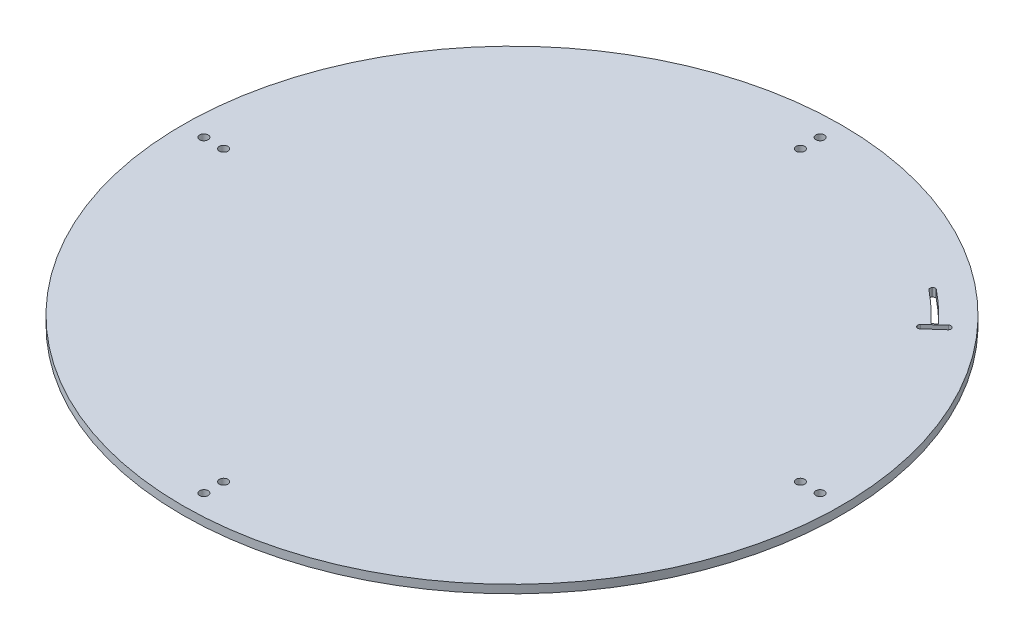
ISO-10303-21;
HEADER;
FILE_DESCRIPTION(('STEP AP214'),'2;1');
FILE_NAME('part.step','',(''),(''),'','','');
FILE_SCHEMA(('AUTOMOTIVE_DESIGN { 1 0 10303 214 1 1 1 1 }'));
ENDSEC;
DATA;
#1=APPLICATION_CONTEXT('core data for automotive mechanical design processes');
#2=APPLICATION_PROTOCOL_DEFINITION('international standard','automotive_design',2000,#1);
#3=PRODUCT_CONTEXT('',#1,'mechanical');
#4=PRODUCT('Part','Part','',(#3));
#5=PRODUCT_RELATED_PRODUCT_CATEGORY('part','',(#4));
#6=PRODUCT_DEFINITION_FORMATION('','',#4);
#7=PRODUCT_DEFINITION_CONTEXT('part definition',#1,'design');
#8=PRODUCT_DEFINITION('design','',#6,#7);
#9=PRODUCT_DEFINITION_SHAPE('','',#8);
#10=(LENGTH_UNIT() NAMED_UNIT(*) SI_UNIT(.MILLI.,.METRE.));
#11=(NAMED_UNIT(*) PLANE_ANGLE_UNIT() SI_UNIT($,.RADIAN.));
#12=(NAMED_UNIT(*) SI_UNIT($,.STERADIAN.) SOLID_ANGLE_UNIT());
#13=UNCERTAINTY_MEASURE_WITH_UNIT(LENGTH_MEASURE(1.E-05),#10,'distance_accuracy_value','');
#14=(GEOMETRIC_REPRESENTATION_CONTEXT(3) GLOBAL_UNCERTAINTY_ASSIGNED_CONTEXT((#13)) GLOBAL_UNIT_ASSIGNED_CONTEXT((#10,
#11,#12)) REPRESENTATION_CONTEXT('',''));
#15=CARTESIAN_POINT('',(0.,0.,0.));
#16=DIRECTION('',(0.,0.,1.));
#17=DIRECTION('',(1.,0.,0.));
#18=AXIS2_PLACEMENT_3D('',#15,#16,#17);
#19=CARTESIAN_POINT('',(0.,5.,0.));
#20=DIRECTION('',(0.,-1.,0.));
#21=DIRECTION('',(0.,0.,-1.));
#22=AXIS2_PLACEMENT_3D('',#19,#20,#21);
#23=CYLINDRICAL_SURFACE('',#22,200.);
#24=CARTESIAN_POINT('',(0.,5.,0.));
#25=DIRECTION('',(0.,1.,0.));
#26=DIRECTION('',(0.,0.,1.));
#27=AXIS2_PLACEMENT_3D('',#24,#25,#26);
#28=CIRCLE('',#27,200.);
#29=CARTESIAN_POINT('',(0.,5.,200.));
#30=VERTEX_POINT('',#29);
#31=EDGE_CURVE('E155',#30,#30,#28,.T.);
#32=ORIENTED_EDGE('',*,*,#31,.F.);
#33=EDGE_LOOP('',(#32));
#34=FACE_BOUND('',#33,.T.);
#35=CARTESIAN_POINT('',(0.,0.,0.));
#36=DIRECTION('',(0.,1.,0.));
#37=DIRECTION('',(0.,0.,1.));
#38=AXIS2_PLACEMENT_3D('',#35,#36,#37);
#39=CIRCLE('',#38,200.);
#40=CARTESIAN_POINT('',(0.,0.,200.));
#41=VERTEX_POINT('',#40);
#42=EDGE_CURVE('E221',#41,#41,#39,.T.);
#43=ORIENTED_EDGE('',*,*,#42,.T.);
#44=EDGE_LOOP('',(#43));
#45=FACE_BOUND('',#44,.T.);
#46=ADVANCED_FACE('F33',(#34,#45),#23,.T.);
#47=CARTESIAN_POINT('',(0.,5.,0.));
#48=DIRECTION('',(0.,1.,0.));
#49=DIRECTION('',(0.,0.,1.));
#50=AXIS2_PLACEMENT_3D('',#47,#48,#49);
#51=PLANE('',#50);
#52=CARTESIAN_POINT('',(0.,5.,0.));
#53=DIRECTION('',(0.,-1.,0.));
#54=DIRECTION('',(0.,0.,1.));
#55=AXIS2_PLACEMENT_3D('',#52,#53,#54);
#56=CIRCLE('',#55,173.85455682411);
#57=CARTESIAN_POINT('',(128.652357162967,5.,-116.935785476133));
#58=VERTEX_POINT('',#57);
#59=CARTESIAN_POINT('',(128.825920219273,5.,-116.74454680269));
#60=VERTEX_POINT('',#59);
#61=EDGE_CURVE('E352',#58,#60,#56,.T.);
#62=ORIENTED_EDGE('',*,*,#61,.F.);
#63=CARTESIAN_POINT('',(129.762357034524,5.,-117.944695920693));
#64=DIRECTION('',(0.,1.,0.));
#65=DIRECTION('',(0.,0.,1.));
#66=AXIS2_PLACEMENT_3D('',#63,#64,#65);
#67=CIRCLE('',#66,1.5);
#68=CARTESIAN_POINT('',(128.74461670106,5.,-119.046605451299));
#69=VERTEX_POINT('',#68);
#70=EDGE_CURVE('E41',#58,#69,#67,.F.);
#71=ORIENTED_EDGE('',*,*,#70,.T.);
#72=DIRECTION('',(-0.734606353737252,0.,0.678493555642837));
#73=VECTOR('',#72,1.);
#74=CARTESIAN_POINT('',(127.646791586562,5.,-118.03263754642));
#75=LINE('',#74,#73);
#76=CARTESIAN_POINT('',(137.704165021297,5.,-127.321779993181));
#77=VERTEX_POINT('',#76);
#78=EDGE_CURVE('E165',#77,#69,#75,.T.);
#79=ORIENTED_EDGE('',*,*,#78,.F.);
#80=CARTESIAN_POINT('',(138.721905354761,5.,-126.219870462575));
#81=DIRECTION('',(0.,1.,0.));
#82=DIRECTION('',(0.,0.,1.));
#83=AXIS2_PLACEMENT_3D('',#80,#81,#82);
#84=CIRCLE('',#83,1.5);
#85=CARTESIAN_POINT('',(139.831381263314,5.,-127.229357068896));
#86=VERTEX_POINT('',#85);
#87=EDGE_CURVE('E55',#77,#86,#84,.F.);
#88=ORIENTED_EDGE('',*,*,#87,.T.);
#89=CARTESIAN_POINT('',(0.,5.,0.));
#90=DIRECTION('',(0.,1.,0.));
#91=DIRECTION('',(0.,0.,1.));
#92=AXIS2_PLACEMENT_3D('',#89,#90,#91);
#93=CIRCLE('',#92,189.05058710877);
#94=CARTESIAN_POINT('',(140.152043186331,5.,-126.876039017884));
#95=VERTEX_POINT('',#94);
#96=EDGE_CURVE('E356',#95,#86,#93,.T.);
#97=ORIENTED_EDGE('',*,*,#96,.F.);
#98=CARTESIAN_POINT('',(139.040023022868,5.,-125.869355772741));
#99=DIRECTION('',(0.,1.,0.));
#100=DIRECTION('',(0.,0.,1.));
#101=AXIS2_PLACEMENT_3D('',#98,#99,#100);
#102=CIRCLE('',#101,1.5);
#103=CARTESIAN_POINT('',(140.038377376564,5.,-124.749852050347));
#104=VERTEX_POINT('',#103);
#105=EDGE_CURVE('E273',#95,#104,#102,.F.);
#106=ORIENTED_EDGE('',*,*,#105,.T.);
#107=DIRECTION('',(0.74633581492959,0.,-0.66556956913112));
#108=VECTOR('',#107,1.);
#109=CARTESIAN_POINT('',(141.161761210603,5.,-125.751666621527));
#110=LINE('',#109,#108);
#111=CARTESIAN_POINT('',(130.935771929489,5.,-116.632303536409));
#112=VERTEX_POINT('',#111);
#113=EDGE_CURVE('E344',#112,#104,#110,.T.);
#114=ORIENTED_EDGE('',*,*,#113,.F.);
#115=CARTESIAN_POINT('',(129.937417575792,5.,-117.751807258803));
#116=DIRECTION('',(0.,1.,0.));
#117=DIRECTION('',(0.,0.,1.));
#118=AXIS2_PLACEMENT_3D('',#115,#116,#117);
#119=CIRCLE('',#118,1.5);
#120=EDGE_CURVE('E269',#112,#60,#119,.F.);
#121=ORIENTED_EDGE('',*,*,#120,.T.);
#122=EDGE_LOOP('',(#62,#71,#79,#88,#97,#106,#114,#121));
#123=FACE_BOUND('',#122,.T.);
#124=DIRECTION('',(-0.622514636637622,0.,0.782608156852412));
#125=VECTOR('',#124,1.);
#126=CARTESIAN_POINT('',(0.,5.,0.));
#127=LINE('',#126,#125);
#128=CARTESIAN_POINT('',(113.044801510574,5.,-142.116792995884));
#129=VERTEX_POINT('',#128);
#130=CARTESIAN_POINT('',(112.920294331169,5.,-141.960266018919));
#131=VERTEX_POINT('',#130);
#132=EDGE_CURVE('E170',#129,#131,#127,.T.);
#133=ORIENTED_EDGE('',*,*,#132,.F.);
#134=CARTESIAN_POINT('',(114.218713745852,5.,-141.183021040928));
#135=DIRECTION('',(0.,1.,0.));
#136=DIRECTION('',(0.,0.,1.));
#137=AXIS2_PLACEMENT_3D('',#134,#135,#136);
#138=CIRCLE('',#137,1.5);
#139=CARTESIAN_POINT('',(115.16215025807,5.,-142.349180355694));
#140=VERTEX_POINT('',#139);
#141=EDGE_CURVE('E246',#129,#140,#138,.F.);
#142=ORIENTED_EDGE('',*,*,#141,.T.);
#143=CARTESIAN_POINT('',(0.,5.,0.));
#144=DIRECTION('',(0.,1.,0.));
#145=DIRECTION('',(0.,0.,1.));
#146=AXIS2_PLACEMENT_3D('',#143,#144,#145);
#147=CIRCLE('',#146,183.1);
#148=CARTESIAN_POINT('',(133.91086276647,5.,-124.873899727444));
#149=VERTEX_POINT('',#148);
#150=EDGE_CURVE('E174',#149,#140,#147,.T.);
#151=ORIENTED_EDGE('',*,*,#150,.F.);
#152=DIRECTION('',(-0.731353701619173,0.,0.681998360062496));
#153=VECTOR('',#152,1.);
#154=CARTESIAN_POINT('',(0.,5.,0.));
#155=LINE('',#154,#153);
#156=CARTESIAN_POINT('',(131.570530921289,5.,-122.691504975242));
#157=VERTEX_POINT('',#156);
#158=EDGE_CURVE('E162',#149,#157,#155,.T.);
#159=ORIENTED_EDGE('',*,*,#158,.T.);
#160=CARTESIAN_POINT('',(0.,5.,0.));
#161=DIRECTION('',(0.,1.,0.));
#162=DIRECTION('',(0.,0.,1.));
#163=AXIS2_PLACEMENT_3D('',#160,#161,#162);
#164=CIRCLE('',#163,179.9);
#165=CARTESIAN_POINT('',(113.150759433868,5.,-139.860343341273));
#166=VERTEX_POINT('',#165);
#167=EDGE_CURVE('E159',#166,#157,#164,.F.);
#168=ORIENTED_EDGE('',*,*,#167,.F.);
#169=CARTESIAN_POINT('',(114.094206566446,5.,-141.026494063963));
#170=DIRECTION('',(0.,1.,0.));
#171=DIRECTION('',(0.,0.,1.));
#172=AXIS2_PLACEMENT_3D('',#169,#170,#171);
#173=CIRCLE('',#172,1.5);
#174=EDGE_CURVE('E244',#166,#131,#173,.F.);
#175=ORIENTED_EDGE('',*,*,#174,.T.);
#176=EDGE_LOOP('',(#133,#142,#151,#159,#168,#175));
#177=FACE_BOUND('',#176,.T.);
#178=CARTESIAN_POINT('',(-187.,5.,1.958721031091E-12));
#179=DIRECTION('',(0.,1.,0.));
#180=DIRECTION('',(-1.,0.,0.));
#181=AXIS2_PLACEMENT_3D('',#178,#179,#180);
#182=CIRCLE('',#181,2.6);
#183=CARTESIAN_POINT('',(-189.6,5.,1.98595458553397E-12));
#184=VERTEX_POINT('',#183);
#185=EDGE_CURVE('E177',#184,#184,#182,.T.);
#186=ORIENTED_EDGE('',*,*,#185,.F.);
#187=EDGE_LOOP('',(#186));
#188=FACE_BOUND('',#187,.T.);
#189=CARTESIAN_POINT('',(187.,5.,-6.52907010363666E-13));
#190=DIRECTION('',(0.,1.,0.));
#191=DIRECTION('',(1.,0.,0.));
#192=AXIS2_PLACEMENT_3D('',#189,#190,#191);
#193=CIRCLE('',#192,2.6);
#194=CARTESIAN_POINT('',(189.6,5.,-6.61984861844658E-13));
#195=VERTEX_POINT('',#194);
#196=EDGE_CURVE('E192',#195,#195,#193,.T.);
#197=ORIENTED_EDGE('',*,*,#196,.F.);
#198=EDGE_LOOP('',(#197));
#199=FACE_BOUND('',#198,.T.);
#200=CARTESIAN_POINT('',(0.,5.,-175.));
#201=DIRECTION('',(0.,1.,0.));
#202=DIRECTION('',(0.,0.,-1.));
#203=AXIS2_PLACEMENT_3D('',#200,#201,#202);
#204=CIRCLE('',#203,2.6);
#205=CARTESIAN_POINT('',(0.,5.,-177.6));
#206=VERTEX_POINT('',#205);
#207=EDGE_CURVE('E185',#206,#206,#204,.T.);
#208=ORIENTED_EDGE('',*,*,#207,.F.);
#209=EDGE_LOOP('',(#208));
#210=FACE_BOUND('',#209,.T.);
#211=CARTESIAN_POINT('',(0.,5.,-187.));
#212=DIRECTION('',(0.,1.,0.));
#213=DIRECTION('',(0.,0.,-1.));
#214=AXIS2_PLACEMENT_3D('',#211,#212,#213);
#215=CIRCLE('',#214,2.6);
#216=CARTESIAN_POINT('',(0.,5.,-189.6));
#217=VERTEX_POINT('',#216);
#218=EDGE_CURVE('E178',#217,#217,#215,.T.);
#219=ORIENTED_EDGE('',*,*,#218,.F.);
#220=EDGE_LOOP('',(#219));
#221=FACE_BOUND('',#220,.T.);
#222=CARTESIAN_POINT('',(-175.,5.,1.83302770289265E-12));
#223=DIRECTION('',(0.,1.,0.));
#224=DIRECTION('',(-1.,0.,0.));
#225=AXIS2_PLACEMENT_3D('',#222,#223,#224);
#226=CIRCLE('',#225,2.6);
#227=CARTESIAN_POINT('',(-177.6,5.,1.86026125733562E-12));
#228=VERTEX_POINT('',#227);
#229=EDGE_CURVE('E186',#228,#228,#226,.T.);
#230=ORIENTED_EDGE('',*,*,#229,.F.);
#231=EDGE_LOOP('',(#230));
#232=FACE_BOUND('',#231,.T.);
#233=CARTESIAN_POINT('',(175.,5.,-6.11009234297548E-13));
#234=DIRECTION('',(0.,1.,0.));
#235=DIRECTION('',(1.,0.,0.));
#236=AXIS2_PLACEMENT_3D('',#233,#234,#235);
#237=CIRCLE('',#236,2.6);
#238=CARTESIAN_POINT('',(177.6,5.,-6.2008708577854E-13));
#239=VERTEX_POINT('',#238);
#240=EDGE_CURVE('E199',#239,#239,#237,.T.);
#241=ORIENTED_EDGE('',*,*,#240,.F.);
#242=EDGE_LOOP('',(#241));
#243=FACE_BOUND('',#242,.T.);
#244=CARTESIAN_POINT('',(0.,5.,175.));
#245=DIRECTION('',(0.,1.,0.));
#246=DIRECTION('',(0.,0.,1.));
#247=AXIS2_PLACEMENT_3D('',#244,#245,#246);
#248=CIRCLE('',#247,2.6);
#249=CARTESIAN_POINT('',(0.,5.,177.6));
#250=VERTEX_POINT('',#249);
#251=EDGE_CURVE('E214',#250,#250,#248,.T.);
#252=ORIENTED_EDGE('',*,*,#251,.F.);
#253=EDGE_LOOP('',(#252));
#254=FACE_BOUND('',#253,.T.);
#255=CARTESIAN_POINT('',(0.,5.,187.));
#256=DIRECTION('',(0.,1.,0.));
#257=DIRECTION('',(0.,0.,1.));
#258=AXIS2_PLACEMENT_3D('',#255,#256,#257);
#259=CIRCLE('',#258,2.6);
#260=CARTESIAN_POINT('',(0.,5.,189.6));
#261=VERTEX_POINT('',#260);
#262=EDGE_CURVE('E213',#261,#261,#259,.T.);
#263=ORIENTED_EDGE('',*,*,#262,.F.);
#264=EDGE_LOOP('',(#263));
#265=FACE_BOUND('',#264,.T.);
#266=ORIENTED_EDGE('',*,*,#31,.T.);
#267=EDGE_LOOP('',(#266));
#268=FACE_BOUND('',#267,.T.);
#269=ADVANCED_FACE('F305',(#123,#177,#188,#199,#210,#221,#232,#243,#254,#265,#268),#51,.T.);
#270=CARTESIAN_POINT('',(0.,0.,0.));
#271=DIRECTION('',(0.,1.,0.));
#272=DIRECTION('',(0.,0.,1.));
#273=AXIS2_PLACEMENT_3D('',#270,#271,#272);
#274=PLANE('',#273);
#275=DIRECTION('',(0.734606353737252,0.,-0.678493555642837));
#276=VECTOR('',#275,1.);
#277=CARTESIAN_POINT('',(127.646791586562,0.,-118.03263754642));
#278=LINE('',#277,#276);
#279=CARTESIAN_POINT('',(128.74461670106,0.,-119.046605451299));
#280=VERTEX_POINT('',#279);
#281=CARTESIAN_POINT('',(137.704165021297,0.,-127.321779993181));
#282=VERTEX_POINT('',#281);
#283=EDGE_CURVE('E284',#280,#282,#278,.T.);
#284=ORIENTED_EDGE('',*,*,#283,.F.);
#285=CARTESIAN_POINT('',(129.762357034524,0.,-117.944695920693));
#286=DIRECTION('',(0.,1.,0.));
#287=DIRECTION('',(0.,0.,1.));
#288=AXIS2_PLACEMENT_3D('',#285,#286,#287);
#289=CIRCLE('',#288,1.5);
#290=CARTESIAN_POINT('',(128.652357162967,0.,-116.935785476133));
#291=VERTEX_POINT('',#290);
#292=EDGE_CURVE('E11',#280,#291,#289,.T.);
#293=ORIENTED_EDGE('',*,*,#292,.T.);
#294=CARTESIAN_POINT('',(0.,0.,0.));
#295=DIRECTION('',(0.,1.,0.));
#296=DIRECTION('',(0.,0.,1.));
#297=AXIS2_PLACEMENT_3D('',#294,#295,#296);
#298=CIRCLE('',#297,173.85455682411);
#299=CARTESIAN_POINT('',(128.825920219273,0.,-116.74454680269));
#300=VERTEX_POINT('',#299);
#301=EDGE_CURVE('E291',#300,#291,#298,.T.);
#302=ORIENTED_EDGE('',*,*,#301,.F.);
#303=CARTESIAN_POINT('',(129.937417575792,0.,-117.751807258803));
#304=DIRECTION('',(0.,1.,0.));
#305=DIRECTION('',(0.,0.,1.));
#306=AXIS2_PLACEMENT_3D('',#303,#304,#305);
#307=CIRCLE('',#306,1.5);
#308=CARTESIAN_POINT('',(130.935771929489,0.,-116.632303536409));
#309=VERTEX_POINT('',#308);
#310=EDGE_CURVE('E271',#300,#309,#307,.T.);
#311=ORIENTED_EDGE('',*,*,#310,.T.);
#312=DIRECTION('',(-0.74633581492959,0.,0.66556956913112));
#313=VECTOR('',#312,1.);
#314=CARTESIAN_POINT('',(141.161761210603,0.,-125.751666621527));
#315=LINE('',#314,#313);
#316=CARTESIAN_POINT('',(140.038377376564,0.,-124.749852050347));
#317=VERTEX_POINT('',#316);
#318=EDGE_CURVE('E160',#317,#309,#315,.T.);
#319=ORIENTED_EDGE('',*,*,#318,.F.);
#320=CARTESIAN_POINT('',(139.040023022868,0.,-125.869355772741));
#321=DIRECTION('',(0.,1.,0.));
#322=DIRECTION('',(0.,0.,1.));
#323=AXIS2_PLACEMENT_3D('',#320,#321,#322);
#324=CIRCLE('',#323,1.5);
#325=CARTESIAN_POINT('',(140.152043186331,0.,-126.876039017884));
#326=VERTEX_POINT('',#325);
#327=EDGE_CURVE('E275',#317,#326,#324,.T.);
#328=ORIENTED_EDGE('',*,*,#327,.T.);
#329=CARTESIAN_POINT('',(0.,0.,0.));
#330=DIRECTION('',(0.,1.,0.));
#331=DIRECTION('',(0.,0.,1.));
#332=AXIS2_PLACEMENT_3D('',#329,#330,#331);
#333=CIRCLE('',#332,189.05058710877);
#334=CARTESIAN_POINT('',(139.831381263314,0.,-127.229357068896));
#335=VERTEX_POINT('',#334);
#336=EDGE_CURVE('E287',#335,#326,#333,.F.);
#337=ORIENTED_EDGE('',*,*,#336,.F.);
#338=CARTESIAN_POINT('',(138.721905354761,0.,-126.219870462575));
#339=DIRECTION('',(0.,1.,0.));
#340=DIRECTION('',(0.,0.,1.));
#341=AXIS2_PLACEMENT_3D('',#338,#339,#340);
#342=CIRCLE('',#341,1.5);
#343=EDGE_CURVE('E278',#335,#282,#342,.T.);
#344=ORIENTED_EDGE('',*,*,#343,.T.);
#345=EDGE_LOOP('',(#284,#293,#302,#311,#319,#328,#337,#344));
#346=FACE_BOUND('',#345,.T.);
#347=CARTESIAN_POINT('',(0.,0.,0.));
#348=DIRECTION('',(0.,1.,0.));
#349=DIRECTION('',(0.,0.,1.));
#350=AXIS2_PLACEMENT_3D('',#347,#348,#349);
#351=CIRCLE('',#350,183.1);
#352=CARTESIAN_POINT('',(133.91086276647,0.,-124.873899727442));
#353=VERTEX_POINT('',#352);
#354=CARTESIAN_POINT('',(115.16215025807,0.,-142.349180355694));
#355=VERTEX_POINT('',#354);
#356=EDGE_CURVE('E145',#353,#355,#351,.T.);
#357=ORIENTED_EDGE('',*,*,#356,.T.);
#358=CARTESIAN_POINT('',(114.218713745852,0.,-141.183021040928));
#359=DIRECTION('',(0.,1.,0.));
#360=DIRECTION('',(0.,0.,1.));
#361=AXIS2_PLACEMENT_3D('',#358,#359,#360);
#362=CIRCLE('',#361,1.5);
#363=CARTESIAN_POINT('',(113.044801510574,0.,-142.116792995884));
#364=VERTEX_POINT('',#363);
#365=EDGE_CURVE('E248',#355,#364,#362,.T.);
#366=ORIENTED_EDGE('',*,*,#365,.T.);
#367=DIRECTION('',(-0.622514636637622,0.,0.782608156852412));
#368=VECTOR('',#367,1.);
#369=CARTESIAN_POINT('',(0.,0.,0.));
#370=LINE('',#369,#368);
#371=CARTESIAN_POINT('',(112.920294331169,0.,-141.960266018919));
#372=VERTEX_POINT('',#371);
#373=EDGE_CURVE('E231',#364,#372,#370,.T.);
#374=ORIENTED_EDGE('',*,*,#373,.T.);
#375=CARTESIAN_POINT('',(114.094206566446,0.,-141.026494063963));
#376=DIRECTION('',(0.,1.,0.));
#377=DIRECTION('',(0.,0.,1.));
#378=AXIS2_PLACEMENT_3D('',#375,#376,#377);
#379=CIRCLE('',#378,1.5);
#380=CARTESIAN_POINT('',(113.150759433868,0.,-139.860343341273));
#381=VERTEX_POINT('',#380);
#382=EDGE_CURVE('E141',#372,#381,#379,.T.);
#383=ORIENTED_EDGE('',*,*,#382,.T.);
#384=CARTESIAN_POINT('',(0.,0.,0.));
#385=DIRECTION('',(0.,1.,0.));
#386=DIRECTION('',(0.,0.,1.));
#387=AXIS2_PLACEMENT_3D('',#384,#385,#386);
#388=CIRCLE('',#387,179.9);
#389=CARTESIAN_POINT('',(131.570530921289,0.,-122.691504975244));
#390=VERTEX_POINT('',#389);
#391=EDGE_CURVE('E134',#381,#390,#388,.F.);
#392=ORIENTED_EDGE('',*,*,#391,.T.);
#393=DIRECTION('',(-0.731353701619173,0.,0.681998360062496));
#394=VECTOR('',#393,1.);
#395=CARTESIAN_POINT('',(0.,0.,0.));
#396=LINE('',#395,#394);
#397=EDGE_CURVE('E139',#353,#390,#396,.T.);
#398=ORIENTED_EDGE('',*,*,#397,.F.);
#399=EDGE_LOOP('',(#357,#366,#374,#383,#392,#398));
#400=FACE_BOUND('',#399,.T.);
#401=CARTESIAN_POINT('',(-187.,0.,1.958721031091E-12));
#402=DIRECTION('',(0.,1.,0.));
#403=DIRECTION('',(0.,0.,1.));
#404=AXIS2_PLACEMENT_3D('',#401,#402,#403);
#405=CIRCLE('',#404,2.6);
#406=CARTESIAN_POINT('',(-187.,0.,2.60000000000196));
#407=VERTEX_POINT('',#406);
#408=EDGE_CURVE('E189',#407,#407,#405,.F.);
#409=ORIENTED_EDGE('',*,*,#408,.F.);
#410=EDGE_LOOP('',(#409));
#411=FACE_BOUND('',#410,.T.);
#412=CARTESIAN_POINT('',(187.,0.,-6.52907010363666E-13));
#413=DIRECTION('',(0.,1.,0.));
#414=DIRECTION('',(0.,0.,1.));
#415=AXIS2_PLACEMENT_3D('',#412,#413,#414);
#416=CIRCLE('',#415,2.6);
#417=CARTESIAN_POINT('',(187.,0.,2.59999999999934));
#418=VERTEX_POINT('',#417);
#419=EDGE_CURVE('E195',#418,#418,#416,.F.);
#420=ORIENTED_EDGE('',*,*,#419,.F.);
#421=EDGE_LOOP('',(#420));
#422=FACE_BOUND('',#421,.T.);
#423=CARTESIAN_POINT('',(0.,0.,-175.));
#424=DIRECTION('',(0.,1.,0.));
#425=DIRECTION('',(0.,0.,1.));
#426=AXIS2_PLACEMENT_3D('',#423,#424,#425);
#427=CIRCLE('',#426,2.6);
#428=CARTESIAN_POINT('',(0.,0.,-172.4));
#429=VERTEX_POINT('',#428);
#430=EDGE_CURVE('E196',#429,#429,#427,.F.);
#431=ORIENTED_EDGE('',*,*,#430,.F.);
#432=EDGE_LOOP('',(#431));
#433=FACE_BOUND('',#432,.T.);
#434=CARTESIAN_POINT('',(0.,0.,-187.));
#435=DIRECTION('',(0.,1.,0.));
#436=DIRECTION('',(0.,0.,1.));
#437=AXIS2_PLACEMENT_3D('',#434,#435,#436);
#438=CIRCLE('',#437,2.6);
#439=CARTESIAN_POINT('',(0.,0.,-184.4));
#440=VERTEX_POINT('',#439);
#441=EDGE_CURVE('E181',#440,#440,#438,.F.);
#442=ORIENTED_EDGE('',*,*,#441,.F.);
#443=EDGE_LOOP('',(#442));
#444=FACE_BOUND('',#443,.T.);
#445=CARTESIAN_POINT('',(-175.,0.,1.83302770289265E-12));
#446=DIRECTION('',(0.,1.,0.));
#447=DIRECTION('',(0.,0.,1.));
#448=AXIS2_PLACEMENT_3D('',#445,#446,#447);
#449=CIRCLE('',#448,2.6);
#450=CARTESIAN_POINT('',(-175.,0.,2.60000000000183));
#451=VERTEX_POINT('',#450);
#452=EDGE_CURVE('E182',#451,#451,#449,.F.);
#453=ORIENTED_EDGE('',*,*,#452,.F.);
#454=EDGE_LOOP('',(#453));
#455=FACE_BOUND('',#454,.T.);
#456=CARTESIAN_POINT('',(175.,0.,-6.11009234297548E-13));
#457=DIRECTION('',(0.,1.,0.));
#458=DIRECTION('',(0.,0.,1.));
#459=AXIS2_PLACEMENT_3D('',#456,#457,#458);
#460=CIRCLE('',#459,2.6);
#461=CARTESIAN_POINT('',(175.,0.,2.59999999999939));
#462=VERTEX_POINT('',#461);
#463=EDGE_CURVE('E210',#462,#462,#460,.F.);
#464=ORIENTED_EDGE('',*,*,#463,.F.);
#465=EDGE_LOOP('',(#464));
#466=FACE_BOUND('',#465,.T.);
#467=CARTESIAN_POINT('',(0.,0.,175.));
#468=DIRECTION('',(0.,1.,0.));
#469=DIRECTION('',(0.,0.,1.));
#470=AXIS2_PLACEMENT_3D('',#467,#468,#469);
#471=CIRCLE('',#470,2.6);
#472=CARTESIAN_POINT('',(0.,0.,177.6));
#473=VERTEX_POINT('',#472);
#474=EDGE_CURVE('E217',#473,#473,#471,.F.);
#475=ORIENTED_EDGE('',*,*,#474,.F.);
#476=EDGE_LOOP('',(#475));
#477=FACE_BOUND('',#476,.T.);
#478=CARTESIAN_POINT('',(0.,0.,187.));
#479=DIRECTION('',(0.,1.,0.));
#480=DIRECTION('',(0.,0.,1.));
#481=AXIS2_PLACEMENT_3D('',#478,#479,#480);
#482=CIRCLE('',#481,2.6);
#483=CARTESIAN_POINT('',(0.,0.,189.6));
#484=VERTEX_POINT('',#483);
#485=EDGE_CURVE('E218',#484,#484,#482,.F.);
#486=ORIENTED_EDGE('',*,*,#485,.F.);
#487=EDGE_LOOP('',(#486));
#488=FACE_BOUND('',#487,.T.);
#489=ORIENTED_EDGE('',*,*,#42,.F.);
#490=EDGE_LOOP('',(#489));
#491=FACE_BOUND('',#490,.T.);
#492=ADVANCED_FACE('F137',(#346,#400,#411,#422,#433,#444,#455,#466,#477,#488,#491),#274,.F.);
#493=CARTESIAN_POINT('',(0.,-0.00100000000000013,187.));
#494=DIRECTION('',(0.,1.,0.));
#495=DIRECTION('',(0.,0.,1.));
#496=AXIS2_PLACEMENT_3D('',#493,#494,#495);
#497=CYLINDRICAL_SURFACE('',#496,2.6);
#498=ORIENTED_EDGE('',*,*,#262,.T.);
#499=EDGE_LOOP('',(#498));
#500=FACE_BOUND('',#499,.T.);
#501=ORIENTED_EDGE('',*,*,#485,.T.);
#502=EDGE_LOOP('',(#501));
#503=FACE_BOUND('',#502,.T.);
#504=ADVANCED_FACE('F379',(#500,#503),#497,.F.);
#505=CARTESIAN_POINT('',(0.,-0.00100000000000013,175.));
#506=DIRECTION('',(0.,1.,0.));
#507=DIRECTION('',(0.,0.,1.));
#508=AXIS2_PLACEMENT_3D('',#505,#506,#507);
#509=CYLINDRICAL_SURFACE('',#508,2.6);
#510=ORIENTED_EDGE('',*,*,#251,.T.);
#511=EDGE_LOOP('',(#510));
#512=FACE_BOUND('',#511,.T.);
#513=ORIENTED_EDGE('',*,*,#474,.T.);
#514=EDGE_LOOP('',(#513));
#515=FACE_BOUND('',#514,.T.);
#516=ADVANCED_FACE('F382',(#512,#515),#509,.F.);
#517=CARTESIAN_POINT('',(175.,-0.00100000000000013,-6.11009234297548E-13));
#518=DIRECTION('',(0.,1.,0.));
#519=DIRECTION('',(0.,0.,1.));
#520=AXIS2_PLACEMENT_3D('',#517,#518,#519);
#521=CYLINDRICAL_SURFACE('',#520,2.6);
#522=ORIENTED_EDGE('',*,*,#240,.T.);
#523=EDGE_LOOP('',(#522));
#524=FACE_BOUND('',#523,.T.);
#525=ORIENTED_EDGE('',*,*,#463,.T.);
#526=EDGE_LOOP('',(#525));
#527=FACE_BOUND('',#526,.T.);
#528=ADVANCED_FACE('F404',(#524,#527),#521,.F.);
#529=CARTESIAN_POINT('',(-175.,-0.00100000000000013,1.83302770289265E-12));
#530=DIRECTION('',(0.,1.,0.));
#531=DIRECTION('',(0.,0.,1.));
#532=AXIS2_PLACEMENT_3D('',#529,#530,#531);
#533=CYLINDRICAL_SURFACE('',#532,2.6);
#534=ORIENTED_EDGE('',*,*,#229,.T.);
#535=EDGE_LOOP('',(#534));
#536=FACE_BOUND('',#535,.T.);
#537=ORIENTED_EDGE('',*,*,#452,.T.);
#538=EDGE_LOOP('',(#537));
#539=FACE_BOUND('',#538,.T.);
#540=ADVANCED_FACE('F412',(#536,#539),#533,.F.);
#541=CARTESIAN_POINT('',(0.,-0.00100000000000013,-187.));
#542=DIRECTION('',(0.,1.,0.));
#543=DIRECTION('',(0.,0.,1.));
#544=AXIS2_PLACEMENT_3D('',#541,#542,#543);
#545=CYLINDRICAL_SURFACE('',#544,2.6);
#546=ORIENTED_EDGE('',*,*,#218,.T.);
#547=EDGE_LOOP('',(#546));
#548=FACE_BOUND('',#547,.T.);
#549=ORIENTED_EDGE('',*,*,#441,.T.);
#550=EDGE_LOOP('',(#549));
#551=FACE_BOUND('',#550,.T.);
#552=ADVANCED_FACE('F420',(#548,#551),#545,.F.);
#553=CARTESIAN_POINT('',(0.,-0.00100000000000013,-175.));
#554=DIRECTION('',(0.,1.,0.));
#555=DIRECTION('',(0.,0.,1.));
#556=AXIS2_PLACEMENT_3D('',#553,#554,#555);
#557=CYLINDRICAL_SURFACE('',#556,2.6);
#558=ORIENTED_EDGE('',*,*,#207,.T.);
#559=EDGE_LOOP('',(#558));
#560=FACE_BOUND('',#559,.T.);
#561=ORIENTED_EDGE('',*,*,#430,.T.);
#562=EDGE_LOOP('',(#561));
#563=FACE_BOUND('',#562,.T.);
#564=ADVANCED_FACE('F428',(#560,#563),#557,.F.);
#565=CARTESIAN_POINT('',(187.,-0.00100000000000013,-6.52907010363666E-13));
#566=DIRECTION('',(0.,1.,0.));
#567=DIRECTION('',(0.,0.,1.));
#568=AXIS2_PLACEMENT_3D('',#565,#566,#567);
#569=CYLINDRICAL_SURFACE('',#568,2.6);
#570=ORIENTED_EDGE('',*,*,#196,.T.);
#571=EDGE_LOOP('',(#570));
#572=FACE_BOUND('',#571,.T.);
#573=ORIENTED_EDGE('',*,*,#419,.T.);
#574=EDGE_LOOP('',(#573));
#575=FACE_BOUND('',#574,.T.);
#576=ADVANCED_FACE('F436',(#572,#575),#569,.F.);
#577=CARTESIAN_POINT('',(-187.,-0.00100000000000013,1.958721031091E-12));
#578=DIRECTION('',(0.,1.,0.));
#579=DIRECTION('',(0.,0.,1.));
#580=AXIS2_PLACEMENT_3D('',#577,#578,#579);
#581=CYLINDRICAL_SURFACE('',#580,2.6);
#582=ORIENTED_EDGE('',*,*,#185,.T.);
#583=EDGE_LOOP('',(#582));
#584=FACE_BOUND('',#583,.T.);
#585=ORIENTED_EDGE('',*,*,#408,.T.);
#586=EDGE_LOOP('',(#585));
#587=FACE_BOUND('',#586,.T.);
#588=ADVANCED_FACE('F444',(#584,#587),#581,.F.);
#589=CARTESIAN_POINT('',(0.,-55.,0.));
#590=DIRECTION('',(0.,-1.,0.));
#591=DIRECTION('',(0.,0.,-1.));
#592=AXIS2_PLACEMENT_3D('',#589,#590,#591);
#593=CYLINDRICAL_SURFACE('',#592,183.1);
#594=ORIENTED_EDGE('',*,*,#150,.T.);
#595=DIRECTION('',(0.,-1.,0.));
#596=VECTOR('',#595,1.);
#597=CARTESIAN_POINT('',(115.16215025807,-55.,-142.349180355694));
#598=LINE('',#597,#596);
#599=EDGE_CURVE('E241',#140,#355,#598,.T.);
#600=ORIENTED_EDGE('',*,*,#599,.T.);
#601=ORIENTED_EDGE('',*,*,#356,.F.);
#602=DIRECTION('',(0.,1.,0.));
#603=VECTOR('',#602,1.);
#604=CARTESIAN_POINT('',(133.91086276647,9.09999999999997,-124.873899727444));
#605=LINE('',#604,#603);
#606=EDGE_CURVE('E153',#353,#149,#605,.T.);
#607=ORIENTED_EDGE('',*,*,#606,.T.);
#608=EDGE_LOOP('',(#594,#600,#601,#607));
#609=FACE_BOUND('',#608,.T.);
#610=ADVANCED_FACE('F452',(#609),#593,.F.);
#611=CARTESIAN_POINT('',(0.,-55.,0.));
#612=DIRECTION('',(0.,-1.,0.));
#613=DIRECTION('',(0.,0.,-1.));
#614=AXIS2_PLACEMENT_3D('',#611,#612,#613);
#615=CYLINDRICAL_SURFACE('',#614,179.9);
#616=ORIENTED_EDGE('',*,*,#391,.F.);
#617=DIRECTION('',(0.,-1.,0.));
#618=VECTOR('',#617,1.);
#619=CARTESIAN_POINT('',(113.150759433868,-55.,-139.860343341273));
#620=LINE('',#619,#618);
#621=EDGE_CURVE('E239',#381,#166,#620,.F.);
#622=ORIENTED_EDGE('',*,*,#621,.T.);
#623=ORIENTED_EDGE('',*,*,#167,.T.);
#624=DIRECTION('',(0.,-1.,0.));
#625=VECTOR('',#624,1.);
#626=CARTESIAN_POINT('',(131.570530921289,9.09999999999997,-122.691504975244));
#627=LINE('',#626,#625);
#628=EDGE_CURVE('E150',#157,#390,#627,.T.);
#629=ORIENTED_EDGE('',*,*,#628,.T.);
#630=EDGE_LOOP('',(#616,#622,#623,#629));
#631=FACE_BOUND('',#630,.T.);
#632=ADVANCED_FACE('F157',(#631),#615,.T.);
#633=CARTESIAN_POINT('',(-6.8423480606014E-13,0.,-5.44264940174486E-13));
#634=DIRECTION('',(-0.782608156852412,0.,-0.622514636637622));
#635=DIRECTION('',(-0.622514636637622,0.,0.782608156852412));
#636=AXIS2_PLACEMENT_3D('',#633,#634,#635);
#637=PLANE('',#636);
#638=ORIENTED_EDGE('',*,*,#132,.T.);
#639=DIRECTION('',(0.,1.,0.));
#640=VECTOR('',#639,1.);
#641=CARTESIAN_POINT('',(112.920294331168,0.,-141.96026601892));
#642=LINE('',#641,#640);
#643=EDGE_CURVE('E236',#131,#372,#642,.F.);
#644=ORIENTED_EDGE('',*,*,#643,.T.);
#645=ORIENTED_EDGE('',*,*,#373,.F.);
#646=DIRECTION('',(0.,1.,0.));
#647=VECTOR('',#646,1.);
#648=CARTESIAN_POINT('',(113.044801510573,5.,-142.116792995885));
#649=LINE('',#648,#647);
#650=EDGE_CURVE('E233',#364,#129,#649,.T.);
#651=ORIENTED_EDGE('',*,*,#650,.T.);
#652=EDGE_LOOP('',(#638,#644,#645,#651));
#653=FACE_BOUND('',#652,.T.);
#654=ADVANCED_FACE('F468',(#653),#637,.F.);
#655=CARTESIAN_POINT('',(-5.9627159715216E-13,0.,-6.39423003462424E-13));
#656=DIRECTION('',(-0.681998360062496,0.,-0.731353701619173));
#657=DIRECTION('',(-0.731353701619173,0.,0.681998360062496));
#658=AXIS2_PLACEMENT_3D('',#655,#656,#657);
#659=PLANE('',#658);
#660=ORIENTED_EDGE('',*,*,#606,.F.);
#661=ORIENTED_EDGE('',*,*,#397,.T.);
#662=ORIENTED_EDGE('',*,*,#628,.F.);
#663=ORIENTED_EDGE('',*,*,#158,.F.);
#664=EDGE_LOOP('',(#660,#661,#662,#663));
#665=FACE_BOUND('',#664,.T.);
#666=ADVANCED_FACE('F149',(#665),#659,.T.);
#667=CARTESIAN_POINT('',(114.094206566446,-55.,-141.026494063963));
#668=DIRECTION('',(0.,-1.,0.));
#669=DIRECTION('',(0.,0.,-1.));
#670=AXIS2_PLACEMENT_3D('',#667,#668,#669);
#671=CYLINDRICAL_SURFACE('',#670,1.5);
#672=ORIENTED_EDGE('',*,*,#174,.F.);
#673=ORIENTED_EDGE('',*,*,#621,.F.);
#674=ORIENTED_EDGE('',*,*,#382,.F.);
#675=ORIENTED_EDGE('',*,*,#643,.F.);
#676=EDGE_LOOP('',(#672,#673,#674,#675));
#677=FACE_BOUND('',#676,.T.);
#678=ADVANCED_FACE('F316',(#677),#671,.F.);
#679=CARTESIAN_POINT('',(114.218713745852,-55.,-141.183021040928));
#680=DIRECTION('',(0.,-1.,0.));
#681=DIRECTION('',(0.,0.,-1.));
#682=AXIS2_PLACEMENT_3D('',#679,#680,#681);
#683=CYLINDRICAL_SURFACE('',#682,1.5);
#684=ORIENTED_EDGE('',*,*,#365,.F.);
#685=ORIENTED_EDGE('',*,*,#599,.F.);
#686=ORIENTED_EDGE('',*,*,#141,.F.);
#687=ORIENTED_EDGE('',*,*,#650,.F.);
#688=EDGE_LOOP('',(#684,#685,#686,#687));
#689=FACE_BOUND('',#688,.T.);
#690=ADVANCED_FACE('F319',(#689),#683,.F.);
#691=CARTESIAN_POINT('',(0.,-0.00100000000000013,0.));
#692=DIRECTION('',(0.,1.,0.));
#693=DIRECTION('',(0.,0.,1.));
#694=AXIS2_PLACEMENT_3D('',#691,#692,#693);
#695=CYLINDRICAL_SURFACE('',#694,173.85455682411);
#696=ORIENTED_EDGE('',*,*,#61,.T.);
#697=DIRECTION('',(0.,1.,0.));
#698=VECTOR('',#697,1.);
#699=CARTESIAN_POINT('',(128.825920219273,-0.00100000000000013,-116.74454680269));
#700=LINE('',#699,#698);
#701=EDGE_CURVE('E258',#60,#300,#700,.F.);
#702=ORIENTED_EDGE('',*,*,#701,.T.);
#703=ORIENTED_EDGE('',*,*,#301,.T.);
#704=DIRECTION('',(0.,1.,0.));
#705=VECTOR('',#704,1.);
#706=CARTESIAN_POINT('',(128.652357162967,-0.00100000000000013,-116.935785476133));
#707=LINE('',#706,#705);
#708=EDGE_CURVE('E255',#291,#58,#707,.T.);
#709=ORIENTED_EDGE('',*,*,#708,.T.);
#710=EDGE_LOOP('',(#696,#702,#703,#709));
#711=FACE_BOUND('',#710,.T.);
#712=ADVANCED_FACE('F323',(#711),#695,.T.);
#713=CARTESIAN_POINT('',(127.646791586562,-0.00100000000000013,-118.03263754642));
#714=DIRECTION('',(-0.678493555642837,0.,-0.734606353737252));
#715=DIRECTION('',(-0.734606353737252,0.,0.678493555642837));
#716=AXIS2_PLACEMENT_3D('',#713,#714,#715);
#717=PLANE('',#716);
#718=ORIENTED_EDGE('',*,*,#283,.T.);
#719=DIRECTION('',(0.,-1.,0.));
#720=VECTOR('',#719,1.);
#721=CARTESIAN_POINT('',(137.704165021297,5.,-127.321779993181));
#722=LINE('',#721,#720);
#723=EDGE_CURVE('E267',#282,#77,#722,.F.);
#724=ORIENTED_EDGE('',*,*,#723,.T.);
#725=ORIENTED_EDGE('',*,*,#78,.T.);
#726=DIRECTION('',(0.,-1.,0.));
#727=VECTOR('',#726,1.);
#728=CARTESIAN_POINT('',(128.74461670106,0.,-119.046605451299));
#729=LINE('',#728,#727);
#730=EDGE_CURVE('E265',#69,#280,#729,.T.);
#731=ORIENTED_EDGE('',*,*,#730,.T.);
#732=EDGE_LOOP('',(#718,#724,#725,#731));
#733=FACE_BOUND('',#732,.T.);
#734=ADVANCED_FACE('F289',(#733),#717,.F.);
#735=CARTESIAN_POINT('',(0.,-0.00100000000000013,0.));
#736=DIRECTION('',(0.,1.,0.));
#737=DIRECTION('',(0.,0.,1.));
#738=AXIS2_PLACEMENT_3D('',#735,#736,#737);
#739=CYLINDRICAL_SURFACE('',#738,189.05058710877);
#740=ORIENTED_EDGE('',*,*,#336,.T.);
#741=DIRECTION('',(0.,1.,0.));
#742=VECTOR('',#741,1.);
#743=CARTESIAN_POINT('',(140.152043186331,-0.00100000000000013,-126.876039017884));
#744=LINE('',#743,#742);
#745=EDGE_CURVE('E262',#326,#95,#744,.T.);
#746=ORIENTED_EDGE('',*,*,#745,.T.);
#747=ORIENTED_EDGE('',*,*,#96,.T.);
#748=DIRECTION('',(0.,1.,0.));
#749=VECTOR('',#748,1.);
#750=CARTESIAN_POINT('',(139.831381263314,-0.00100000000000013,-127.229357068896));
#751=LINE('',#750,#749);
#752=EDGE_CURVE('E260',#86,#335,#751,.F.);
#753=ORIENTED_EDGE('',*,*,#752,.T.);
#754=EDGE_LOOP('',(#740,#746,#747,#753));
#755=FACE_BOUND('',#754,.T.);
#756=ADVANCED_FACE('F331',(#755),#739,.F.);
#757=CARTESIAN_POINT('',(141.161761210603,-0.00100000000000013,-125.751666621527));
#758=DIRECTION('',(0.66556956913112,0.,0.74633581492959));
#759=DIRECTION('',(0.74633581492959,0.,-0.66556956913112));
#760=AXIS2_PLACEMENT_3D('',#757,#758,#759);
#761=PLANE('',#760);
#762=ORIENTED_EDGE('',*,*,#318,.T.);
#763=DIRECTION('',(0.,-1.,0.));
#764=VECTOR('',#763,1.);
#765=CARTESIAN_POINT('',(130.935771929489,5.,-116.632303536409));
#766=LINE('',#765,#764);
#767=EDGE_CURVE('E252',#309,#112,#766,.F.);
#768=ORIENTED_EDGE('',*,*,#767,.T.);
#769=ORIENTED_EDGE('',*,*,#113,.T.);
#770=DIRECTION('',(0.,-1.,0.));
#771=VECTOR('',#770,1.);
#772=CARTESIAN_POINT('',(140.038377376564,0.,-124.749852050347));
#773=LINE('',#772,#771);
#774=EDGE_CURVE('E250',#104,#317,#773,.T.);
#775=ORIENTED_EDGE('',*,*,#774,.T.);
#776=EDGE_LOOP('',(#762,#768,#769,#775));
#777=FACE_BOUND('',#776,.T.);
#778=ADVANCED_FACE('F326',(#777),#761,.F.);
#779=CARTESIAN_POINT('',(129.937417575792,-0.00100000000000013,-117.751807258803));
#780=DIRECTION('',(0.,1.,0.));
#781=DIRECTION('',(0.,0.,1.));
#782=AXIS2_PLACEMENT_3D('',#779,#780,#781);
#783=CYLINDRICAL_SURFACE('',#782,1.5);
#784=ORIENTED_EDGE('',*,*,#310,.F.);
#785=ORIENTED_EDGE('',*,*,#701,.F.);
#786=ORIENTED_EDGE('',*,*,#120,.F.);
#787=ORIENTED_EDGE('',*,*,#767,.F.);
#788=EDGE_LOOP('',(#784,#785,#786,#787));
#789=FACE_BOUND('',#788,.T.);
#790=ADVANCED_FACE('F301',(#789),#783,.F.);
#791=CARTESIAN_POINT('',(139.040023022868,-0.00100000000000013,-125.869355772741));
#792=DIRECTION('',(0.,1.,0.));
#793=DIRECTION('',(0.,0.,1.));
#794=AXIS2_PLACEMENT_3D('',#791,#792,#793);
#795=CYLINDRICAL_SURFACE('',#794,1.5);
#796=ORIENTED_EDGE('',*,*,#327,.F.);
#797=ORIENTED_EDGE('',*,*,#774,.F.);
#798=ORIENTED_EDGE('',*,*,#105,.F.);
#799=ORIENTED_EDGE('',*,*,#745,.F.);
#800=EDGE_LOOP('',(#796,#797,#798,#799));
#801=FACE_BOUND('',#800,.T.);
#802=ADVANCED_FACE('F295',(#801),#795,.F.);
#803=CARTESIAN_POINT('',(138.721905354761,-0.00100000000000013,-126.219870462575));
#804=DIRECTION('',(0.,1.,0.));
#805=DIRECTION('',(0.,0.,1.));
#806=AXIS2_PLACEMENT_3D('',#803,#804,#805);
#807=CYLINDRICAL_SURFACE('',#806,1.5);
#808=ORIENTED_EDGE('',*,*,#343,.F.);
#809=ORIENTED_EDGE('',*,*,#752,.F.);
#810=ORIENTED_EDGE('',*,*,#87,.F.);
#811=ORIENTED_EDGE('',*,*,#723,.F.);
#812=EDGE_LOOP('',(#808,#809,#810,#811));
#813=FACE_BOUND('',#812,.T.);
#814=ADVANCED_FACE('F293',(#813),#807,.F.);
#815=CARTESIAN_POINT('',(129.762357034524,-0.00100000000000013,-117.944695920693));
#816=DIRECTION('',(0.,1.,0.));
#817=DIRECTION('',(0.,0.,1.));
#818=AXIS2_PLACEMENT_3D('',#815,#816,#817);
#819=CYLINDRICAL_SURFACE('',#818,1.5);
#820=ORIENTED_EDGE('',*,*,#292,.F.);
#821=ORIENTED_EDGE('',*,*,#730,.F.);
#822=ORIENTED_EDGE('',*,*,#70,.F.);
#823=ORIENTED_EDGE('',*,*,#708,.F.);
#824=EDGE_LOOP('',(#820,#821,#822,#823));
#825=FACE_BOUND('',#824,.T.);
#826=ADVANCED_FACE('F35',(#825),#819,.F.);
#827=CLOSED_SHELL('',(#46,#269,#492,#504,#516,#528,#540,#552,#564,#576,#588,#610,#632,#654,#666,
#678,#690,#712,#734,#756,#778,#790,#802,#814,#826));
#828=MANIFOLD_SOLID_BREP('B2',#827);
#829=ADVANCED_BREP_SHAPE_REPRESENTATION('',(#18,#828),#14);
#830=SHAPE_DEFINITION_REPRESENTATION(#9,#829);
ENDSEC;
END-ISO-10303-21;
